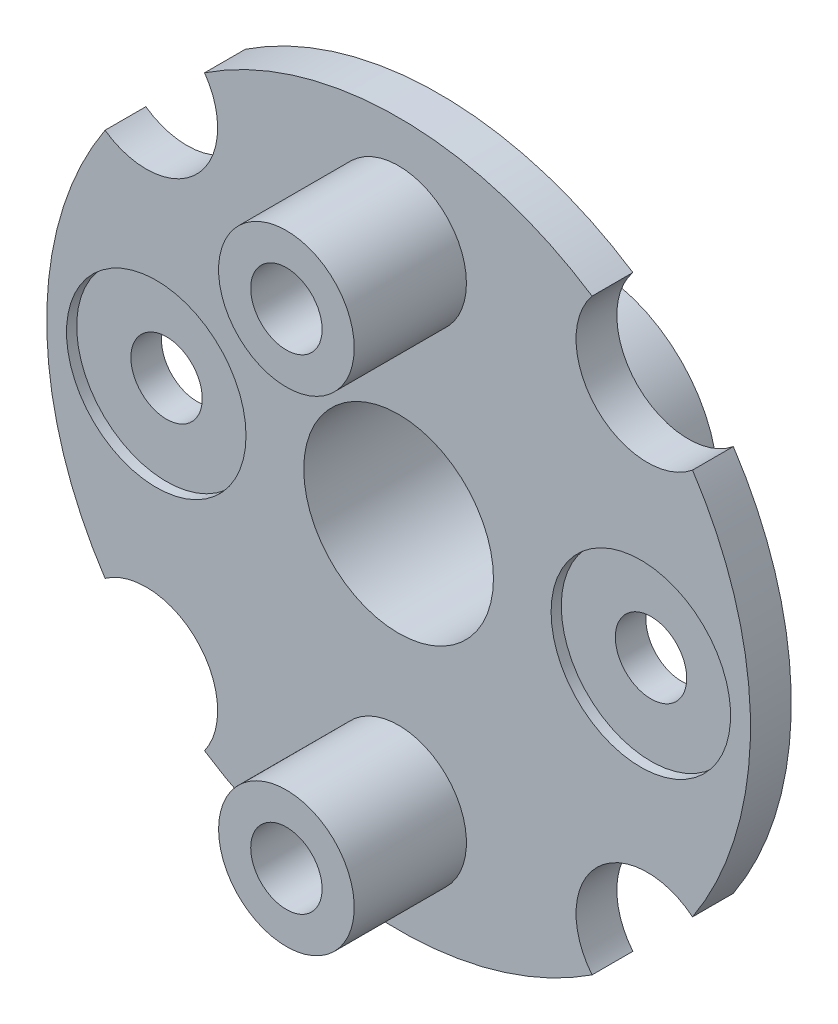
ISO-10303-21;
HEADER;
FILE_DESCRIPTION(('STEP AP214'),'2;1');
FILE_NAME('part.step','',(''),(''),'','','');
FILE_SCHEMA(('AUTOMOTIVE_DESIGN { 1 0 10303 214 1 1 1 1 }'));
ENDSEC;
DATA;
#1=APPLICATION_CONTEXT('core data for automotive mechanical design processes');
#2=APPLICATION_PROTOCOL_DEFINITION('international standard','automotive_design',2000,#1);
#3=PRODUCT_CONTEXT('',#1,'mechanical');
#4=PRODUCT('Part','Part','',(#3));
#5=PRODUCT_RELATED_PRODUCT_CATEGORY('part','',(#4));
#6=PRODUCT_DEFINITION_FORMATION('','',#4);
#7=PRODUCT_DEFINITION_CONTEXT('part definition',#1,'design');
#8=PRODUCT_DEFINITION('design','',#6,#7);
#9=PRODUCT_DEFINITION_SHAPE('','',#8);
#10=(LENGTH_UNIT() NAMED_UNIT(*) SI_UNIT(.MILLI.,.METRE.));
#11=(NAMED_UNIT(*) PLANE_ANGLE_UNIT() SI_UNIT($,.RADIAN.));
#12=(NAMED_UNIT(*) SI_UNIT($,.STERADIAN.) SOLID_ANGLE_UNIT());
#13=UNCERTAINTY_MEASURE_WITH_UNIT(LENGTH_MEASURE(1.E-05),#10,'distance_accuracy_value','');
#14=(GEOMETRIC_REPRESENTATION_CONTEXT(3) GLOBAL_UNCERTAINTY_ASSIGNED_CONTEXT((#13)) GLOBAL_UNIT_ASSIGNED_CONTEXT((#10,
#11,#12)) REPRESENTATION_CONTEXT('',''));
#15=CARTESIAN_POINT('',(0.,0.,0.));
#16=DIRECTION('',(0.,0.,1.));
#17=DIRECTION('',(1.,0.,0.));
#18=AXIS2_PLACEMENT_3D('',#15,#16,#17);
#19=CARTESIAN_POINT('',(-11.875,0.,2.));
#20=DIRECTION('',(0.,0.,-1.));
#21=DIRECTION('',(-1.,0.,0.));
#22=AXIS2_PLACEMENT_3D('',#19,#20,#21);
#23=CYLINDRICAL_SURFACE('',#22,1.75);
#24=CARTESIAN_POINT('',(-11.875,0.,0.));
#25=DIRECTION('',(0.,0.,1.));
#26=DIRECTION('',(1.,0.,0.));
#27=AXIS2_PLACEMENT_3D('',#24,#25,#26);
#28=CIRCLE('',#27,1.75);
#29=CARTESIAN_POINT('',(-10.125,0.,0.));
#30=VERTEX_POINT('',#29);
#31=EDGE_CURVE('E133',#30,#30,#28,.F.);
#32=ORIENTED_EDGE('',*,*,#31,.T.);
#33=EDGE_LOOP('',(#32));
#34=FACE_BOUND('',#33,.T.);
#35=CARTESIAN_POINT('',(-11.875,0.,1.5));
#36=DIRECTION('',(0.,0.,1.));
#37=DIRECTION('',(1.,0.,0.));
#38=AXIS2_PLACEMENT_3D('',#35,#36,#37);
#39=CIRCLE('',#38,1.75);
#40=CARTESIAN_POINT('',(-10.125,0.,1.5));
#41=VERTEX_POINT('',#40);
#42=EDGE_CURVE('E174',#41,#41,#39,.F.);
#43=ORIENTED_EDGE('',*,*,#42,.F.);
#44=EDGE_LOOP('',(#43));
#45=FACE_BOUND('',#44,.T.);
#46=ADVANCED_FACE('F34',(#34,#45),#23,.F.);
#47=CARTESIAN_POINT('',(0.,0.,2.));
#48=DIRECTION('',(0.,0.,1.));
#49=DIRECTION('',(1.,0.,0.));
#50=AXIS2_PLACEMENT_3D('',#47,#48,#49);
#51=PLANE('',#50);
#52=CARTESIAN_POINT('',(11.875,0.,2.));
#53=DIRECTION('',(0.,0.,1.));
#54=DIRECTION('',(-1.,0.,0.));
#55=AXIS2_PLACEMENT_3D('',#52,#53,#54);
#56=CIRCLE('',#55,4.4);
#57=CARTESIAN_POINT('',(7.475,0.,2.));
#58=VERTEX_POINT('',#57);
#59=EDGE_CURVE('E191',#58,#58,#56,.T.);
#60=ORIENTED_EDGE('',*,*,#59,.F.);
#61=EDGE_LOOP('',(#60));
#62=FACE_BOUND('',#61,.T.);
#63=CARTESIAN_POINT('',(-11.88,0.,2.));
#64=DIRECTION('',(0.,0.,1.));
#65=DIRECTION('',(1.,0.,0.));
#66=AXIS2_PLACEMENT_3D('',#63,#64,#65);
#67=CIRCLE('',#66,4.4);
#68=CARTESIAN_POINT('',(-7.48,0.,2.));
#69=VERTEX_POINT('',#68);
#70=EDGE_CURVE('E184',#69,#69,#67,.T.);
#71=ORIENTED_EDGE('',*,*,#70,.F.);
#72=EDGE_LOOP('',(#71));
#73=FACE_BOUND('',#72,.T.);
#74=CARTESIAN_POINT('',(0.,11.875,2.));
#75=DIRECTION('',(0.,0.,1.));
#76=DIRECTION('',(1.,0.,0.));
#77=AXIS2_PLACEMENT_3D('',#74,#75,#76);
#78=CIRCLE('',#77,3.325);
#79=CARTESIAN_POINT('',(3.325,11.875,2.));
#80=VERTEX_POINT('',#79);
#81=EDGE_CURVE('E202',#80,#80,#78,.T.);
#82=ORIENTED_EDGE('',*,*,#81,.F.);
#83=EDGE_LOOP('',(#82));
#84=FACE_BOUND('',#83,.T.);
#85=CARTESIAN_POINT('',(0.,0.,2.));
#86=DIRECTION('',(0.,0.,1.));
#87=DIRECTION('',(1.,0.,0.));
#88=AXIS2_PLACEMENT_3D('',#85,#86,#87);
#89=CIRCLE('',#88,4.65);
#90=CARTESIAN_POINT('',(4.65,0.,2.));
#91=VERTEX_POINT('',#90);
#92=EDGE_CURVE('E164',#91,#91,#89,.T.);
#93=ORIENTED_EDGE('',*,*,#92,.F.);
#94=EDGE_LOOP('',(#93));
#95=FACE_BOUND('',#94,.T.);
#96=CARTESIAN_POINT('',(12.197591975468,-12.1975919754679,2.));
#97=DIRECTION('',(0.,0.,1.));
#98=DIRECTION('',(1.,0.,0.));
#99=AXIS2_PLACEMENT_3D('',#96,#97,#98);
#100=CIRCLE('',#99,3.5);
#101=CARTESIAN_POINT('',(9.48441267789938,-14.4086229791504,2.));
#102=VERTEX_POINT('',#101);
#103=CARTESIAN_POINT('',(14.4086229791504,-9.48441267789933,2.));
#104=VERTEX_POINT('',#103);
#105=EDGE_CURVE('E215',#102,#104,#100,.F.);
#106=ORIENTED_EDGE('',*,*,#105,.T.);
#107=CARTESIAN_POINT('',(0.,0.,2.));
#108=DIRECTION('',(0.,0.,1.));
#109=DIRECTION('',(1.,0.,0.));
#110=AXIS2_PLACEMENT_3D('',#107,#108,#109);
#111=CIRCLE('',#110,17.25);
#112=CARTESIAN_POINT('',(14.4086229791505,9.48441267789933,2.));
#113=VERTEX_POINT('',#112);
#114=EDGE_CURVE('E96',#104,#113,#111,.T.);
#115=ORIENTED_EDGE('',*,*,#114,.T.);
#116=CARTESIAN_POINT('',(12.197591975468,12.1975919754679,2.));
#117=DIRECTION('',(0.,0.,1.));
#118=DIRECTION('',(1.,0.,0.));
#119=AXIS2_PLACEMENT_3D('',#116,#117,#118);
#120=CIRCLE('',#119,3.5);
#121=CARTESIAN_POINT('',(9.48441267789937,14.4086229791504,2.));
#122=VERTEX_POINT('',#121);
#123=EDGE_CURVE('E218',#122,#113,#120,.T.);
#124=ORIENTED_EDGE('',*,*,#123,.F.);
#125=CARTESIAN_POINT('',(0.,0.,2.));
#126=DIRECTION('',(0.,0.,1.));
#127=DIRECTION('',(1.,0.,0.));
#128=AXIS2_PLACEMENT_3D('',#125,#126,#127);
#129=CIRCLE('',#128,17.25);
#130=CARTESIAN_POINT('',(-9.51211084499058,14.390352576383,2.));
#131=VERTEX_POINT('',#130);
#132=EDGE_CURVE('E221',#122,#131,#129,.T.);
#133=ORIENTED_EDGE('',*,*,#132,.T.);
#134=CARTESIAN_POINT('',(-12.370384907651,12.370384907651,2.));
#135=DIRECTION('',(0.,0.,1.));
#136=DIRECTION('',(1.,0.,0.));
#137=AXIS2_PLACEMENT_3D('',#134,#135,#136);
#138=CIRCLE('',#137,3.5);
#139=CARTESIAN_POINT('',(-14.390352576383,9.51211084499056,2.));
#140=VERTEX_POINT('',#139);
#141=EDGE_CURVE('E117',#140,#131,#138,.T.);
#142=ORIENTED_EDGE('',*,*,#141,.F.);
#143=CARTESIAN_POINT('',(0.,0.,2.));
#144=DIRECTION('',(0.,0.,1.));
#145=DIRECTION('',(1.,0.,0.));
#146=AXIS2_PLACEMENT_3D('',#143,#144,#145);
#147=CIRCLE('',#146,17.25);
#148=CARTESIAN_POINT('',(-14.390352576383,-9.51211084499055,2.));
#149=VERTEX_POINT('',#148);
#150=EDGE_CURVE('E110',#140,#149,#147,.T.);
#151=ORIENTED_EDGE('',*,*,#150,.T.);
#152=CARTESIAN_POINT('',(-12.370384907651,-12.370384907651,2.));
#153=DIRECTION('',(0.,0.,1.));
#154=DIRECTION('',(1.,0.,0.));
#155=AXIS2_PLACEMENT_3D('',#152,#153,#154);
#156=CIRCLE('',#155,3.5);
#157=CARTESIAN_POINT('',(-9.51211084499056,-14.390352576383,2.));
#158=VERTEX_POINT('',#157);
#159=EDGE_CURVE('E115',#149,#158,#156,.F.);
#160=ORIENTED_EDGE('',*,*,#159,.T.);
#161=CARTESIAN_POINT('',(0.,0.,2.));
#162=DIRECTION('',(0.,0.,1.));
#163=DIRECTION('',(1.,0.,0.));
#164=AXIS2_PLACEMENT_3D('',#161,#162,#163);
#165=CIRCLE('',#164,17.25);
#166=EDGE_CURVE('E52',#158,#102,#165,.T.);
#167=ORIENTED_EDGE('',*,*,#166,.T.);
#168=EDGE_LOOP('',(#106,#115,#124,#133,#142,#151,#160,#167));
#169=FACE_BOUND('',#168,.T.);
#170=CARTESIAN_POINT('',(0.,-11.875,2.));
#171=DIRECTION('',(0.,0.,1.));
#172=DIRECTION('',(-1.,0.,0.));
#173=AXIS2_PLACEMENT_3D('',#170,#171,#172);
#174=CIRCLE('',#173,3.325);
#175=CARTESIAN_POINT('',(-3.325,-11.875,2.));
#176=VERTEX_POINT('',#175);
#177=EDGE_CURVE('E181',#176,#176,#174,.T.);
#178=ORIENTED_EDGE('',*,*,#177,.F.);
#179=EDGE_LOOP('',(#178));
#180=FACE_BOUND('',#179,.T.);
#181=ADVANCED_FACE('F112',(#62,#73,#84,#95,#169,#180),#51,.T.);
#182=CARTESIAN_POINT('',(0.,0.,0.));
#183=DIRECTION('',(0.,0.,1.));
#184=DIRECTION('',(1.,0.,0.));
#185=AXIS2_PLACEMENT_3D('',#182,#183,#184);
#186=PLANE('',#185);
#187=CARTESIAN_POINT('',(12.197591975468,-12.1975919754679,0.));
#188=DIRECTION('',(0.,0.,1.));
#189=DIRECTION('',(1.,0.,0.));
#190=AXIS2_PLACEMENT_3D('',#187,#188,#189);
#191=CIRCLE('',#190,3.5);
#192=CARTESIAN_POINT('',(9.48441267789938,-14.4086229791504,0.));
#193=VERTEX_POINT('',#192);
#194=CARTESIAN_POINT('',(14.4086229791504,-9.48441267789933,0.));
#195=VERTEX_POINT('',#194);
#196=EDGE_CURVE('E146',#193,#195,#191,.F.);
#197=ORIENTED_EDGE('',*,*,#196,.F.);
#198=CARTESIAN_POINT('',(0.,0.,0.));
#199=DIRECTION('',(0.,0.,1.));
#200=DIRECTION('',(1.,0.,0.));
#201=AXIS2_PLACEMENT_3D('',#198,#199,#200);
#202=CIRCLE('',#201,17.25);
#203=CARTESIAN_POINT('',(-9.51211084499056,-14.390352576383,0.));
#204=VERTEX_POINT('',#203);
#205=EDGE_CURVE('E87',#204,#193,#202,.T.);
#206=ORIENTED_EDGE('',*,*,#205,.F.);
#207=CARTESIAN_POINT('',(-12.370384907651,-12.370384907651,0.));
#208=DIRECTION('',(0.,0.,1.));
#209=DIRECTION('',(1.,0.,0.));
#210=AXIS2_PLACEMENT_3D('',#207,#208,#209);
#211=CIRCLE('',#210,3.5);
#212=CARTESIAN_POINT('',(-14.390352576383,-9.51211084499055,0.));
#213=VERTEX_POINT('',#212);
#214=EDGE_CURVE('E81',#213,#204,#211,.F.);
#215=ORIENTED_EDGE('',*,*,#214,.F.);
#216=CARTESIAN_POINT('',(0.,0.,0.));
#217=DIRECTION('',(0.,0.,1.));
#218=DIRECTION('',(1.,0.,0.));
#219=AXIS2_PLACEMENT_3D('',#216,#217,#218);
#220=CIRCLE('',#219,17.25);
#221=CARTESIAN_POINT('',(-14.390352576383,9.51211084499056,0.));
#222=VERTEX_POINT('',#221);
#223=EDGE_CURVE('E123',#222,#213,#220,.T.);
#224=ORIENTED_EDGE('',*,*,#223,.F.);
#225=CARTESIAN_POINT('',(-12.370384907651,12.370384907651,0.));
#226=DIRECTION('',(0.,0.,1.));
#227=DIRECTION('',(1.,0.,0.));
#228=AXIS2_PLACEMENT_3D('',#225,#226,#227);
#229=CIRCLE('',#228,3.5);
#230=CARTESIAN_POINT('',(-9.51211084499058,14.390352576383,0.));
#231=VERTEX_POINT('',#230);
#232=EDGE_CURVE('E158',#222,#231,#229,.T.);
#233=ORIENTED_EDGE('',*,*,#232,.T.);
#234=CARTESIAN_POINT('',(0.,0.,0.));
#235=DIRECTION('',(0.,0.,1.));
#236=DIRECTION('',(1.,0.,0.));
#237=AXIS2_PLACEMENT_3D('',#234,#235,#236);
#238=CIRCLE('',#237,17.25);
#239=CARTESIAN_POINT('',(9.48441267789937,14.4086229791504,0.));
#240=VERTEX_POINT('',#239);
#241=EDGE_CURVE('E155',#240,#231,#238,.T.);
#242=ORIENTED_EDGE('',*,*,#241,.F.);
#243=CARTESIAN_POINT('',(12.197591975468,12.1975919754679,0.));
#244=DIRECTION('',(0.,0.,1.));
#245=DIRECTION('',(1.,0.,0.));
#246=AXIS2_PLACEMENT_3D('',#243,#244,#245);
#247=CIRCLE('',#246,3.5);
#248=CARTESIAN_POINT('',(14.4086229791505,9.48441267789933,0.));
#249=VERTEX_POINT('',#248);
#250=EDGE_CURVE('E152',#240,#249,#247,.T.);
#251=ORIENTED_EDGE('',*,*,#250,.T.);
#252=CARTESIAN_POINT('',(0.,0.,0.));
#253=DIRECTION('',(0.,0.,1.));
#254=DIRECTION('',(1.,0.,0.));
#255=AXIS2_PLACEMENT_3D('',#252,#253,#254);
#256=CIRCLE('',#255,17.25);
#257=EDGE_CURVE('E149',#195,#249,#256,.T.);
#258=ORIENTED_EDGE('',*,*,#257,.F.);
#259=EDGE_LOOP('',(#197,#206,#215,#224,#233,#242,#251,#258));
#260=FACE_BOUND('',#259,.T.);
#261=CARTESIAN_POINT('',(0.,-11.875,0.));
#262=DIRECTION('',(0.,0.,1.));
#263=DIRECTION('',(1.,0.,0.));
#264=AXIS2_PLACEMENT_3D('',#261,#262,#263);
#265=CIRCLE('',#264,1.75);
#266=CARTESIAN_POINT('',(1.75,-11.875,0.));
#267=VERTEX_POINT('',#266);
#268=EDGE_CURVE('E143',#267,#267,#265,.F.);
#269=ORIENTED_EDGE('',*,*,#268,.F.);
#270=EDGE_LOOP('',(#269));
#271=FACE_BOUND('',#270,.T.);
#272=CARTESIAN_POINT('',(11.875,0.,0.));
#273=DIRECTION('',(0.,0.,1.));
#274=DIRECTION('',(1.,0.,0.));
#275=AXIS2_PLACEMENT_3D('',#272,#273,#274);
#276=CIRCLE('',#275,1.75);
#277=CARTESIAN_POINT('',(13.625,0.,0.));
#278=VERTEX_POINT('',#277);
#279=EDGE_CURVE('E140',#278,#278,#276,.T.);
#280=ORIENTED_EDGE('',*,*,#279,.T.);
#281=EDGE_LOOP('',(#280));
#282=FACE_BOUND('',#281,.T.);
#283=CARTESIAN_POINT('',(0.,11.875,0.));
#284=DIRECTION('',(0.,0.,1.));
#285=DIRECTION('',(1.,0.,0.));
#286=AXIS2_PLACEMENT_3D('',#283,#284,#285);
#287=CIRCLE('',#286,1.75);
#288=CARTESIAN_POINT('',(1.75,11.875,0.));
#289=VERTEX_POINT('',#288);
#290=EDGE_CURVE('E136',#289,#289,#287,.T.);
#291=ORIENTED_EDGE('',*,*,#290,.T.);
#292=EDGE_LOOP('',(#291));
#293=FACE_BOUND('',#292,.T.);
#294=ORIENTED_EDGE('',*,*,#31,.F.);
#295=EDGE_LOOP('',(#294));
#296=FACE_BOUND('',#295,.T.);
#297=CARTESIAN_POINT('',(0.,0.,0.));
#298=DIRECTION('',(0.,0.,1.));
#299=DIRECTION('',(1.,0.,0.));
#300=AXIS2_PLACEMENT_3D('',#297,#298,#299);
#301=CIRCLE('',#300,6.15);
#302=CARTESIAN_POINT('',(6.15,0.,0.));
#303=VERTEX_POINT('',#302);
#304=EDGE_CURVE('E11',#303,#303,#301,.F.);
#305=ORIENTED_EDGE('',*,*,#304,.F.);
#306=EDGE_LOOP('',(#305));
#307=FACE_BOUND('',#306,.T.);
#308=ADVANCED_FACE('F228',(#260,#271,#282,#293,#296,#307),#186,.F.);
#309=CARTESIAN_POINT('',(12.197591975468,-12.1975919754679,2.));
#310=DIRECTION('',(0.,0.,-1.));
#311=DIRECTION('',(-1.,0.,0.));
#312=AXIS2_PLACEMENT_3D('',#309,#310,#311);
#313=CYLINDRICAL_SURFACE('',#312,3.5);
#314=ORIENTED_EDGE('',*,*,#196,.T.);
#315=DIRECTION('',(0.,0.,-1.));
#316=VECTOR('',#315,1.);
#317=CARTESIAN_POINT('',(14.4086229791504,-9.48441267789933,2.));
#318=LINE('',#317,#316);
#319=EDGE_CURVE('E43',#104,#195,#318,.T.);
#320=ORIENTED_EDGE('',*,*,#319,.F.);
#321=ORIENTED_EDGE('',*,*,#105,.F.);
#322=DIRECTION('',(0.,0.,-1.));
#323=VECTOR('',#322,1.);
#324=CARTESIAN_POINT('',(9.48441267789938,-14.4086229791504,2.));
#325=LINE('',#324,#323);
#326=EDGE_CURVE('E129',#102,#193,#325,.T.);
#327=ORIENTED_EDGE('',*,*,#326,.T.);
#328=EDGE_LOOP('',(#314,#320,#321,#327));
#329=FACE_BOUND('',#328,.T.);
#330=ADVANCED_FACE('F233',(#329),#313,.F.);
#331=CARTESIAN_POINT('',(0.,0.,2.));
#332=DIRECTION('',(0.,0.,-1.));
#333=DIRECTION('',(-1.,0.,0.));
#334=AXIS2_PLACEMENT_3D('',#331,#332,#333);
#335=CYLINDRICAL_SURFACE('',#334,17.25);
#336=ORIENTED_EDGE('',*,*,#257,.T.);
#337=DIRECTION('',(0.,0.,-1.));
#338=VECTOR('',#337,1.);
#339=CARTESIAN_POINT('',(14.4086229791505,9.48441267789933,2.));
#340=LINE('',#339,#338);
#341=EDGE_CURVE('E172',#113,#249,#340,.T.);
#342=ORIENTED_EDGE('',*,*,#341,.F.);
#343=ORIENTED_EDGE('',*,*,#114,.F.);
#344=ORIENTED_EDGE('',*,*,#319,.T.);
#345=EDGE_LOOP('',(#336,#342,#343,#344));
#346=FACE_BOUND('',#345,.T.);
#347=ADVANCED_FACE('F348',(#346),#335,.T.);
#348=CARTESIAN_POINT('',(12.197591975468,12.1975919754679,2.));
#349=DIRECTION('',(0.,0.,-1.));
#350=DIRECTION('',(-1.,0.,0.));
#351=AXIS2_PLACEMENT_3D('',#348,#349,#350);
#352=CYLINDRICAL_SURFACE('',#351,3.5);
#353=ORIENTED_EDGE('',*,*,#250,.F.);
#354=DIRECTION('',(0.,0.,-1.));
#355=VECTOR('',#354,1.);
#356=CARTESIAN_POINT('',(9.48441267789937,14.4086229791504,2.));
#357=LINE('',#356,#355);
#358=EDGE_CURVE('E170',#122,#240,#357,.T.);
#359=ORIENTED_EDGE('',*,*,#358,.F.);
#360=ORIENTED_EDGE('',*,*,#123,.T.);
#361=ORIENTED_EDGE('',*,*,#341,.T.);
#362=EDGE_LOOP('',(#353,#359,#360,#361));
#363=FACE_BOUND('',#362,.T.);
#364=ADVANCED_FACE('F351',(#363),#352,.F.);
#365=CARTESIAN_POINT('',(0.,0.,2.));
#366=DIRECTION('',(0.,0.,-1.));
#367=DIRECTION('',(-1.,0.,0.));
#368=AXIS2_PLACEMENT_3D('',#365,#366,#367);
#369=CYLINDRICAL_SURFACE('',#368,17.25);
#370=ORIENTED_EDGE('',*,*,#241,.T.);
#371=DIRECTION('',(0.,0.,-1.));
#372=VECTOR('',#371,1.);
#373=CARTESIAN_POINT('',(-9.51211084499058,14.390352576383,2.));
#374=LINE('',#373,#372);
#375=EDGE_CURVE('E168',#131,#231,#374,.T.);
#376=ORIENTED_EDGE('',*,*,#375,.F.);
#377=ORIENTED_EDGE('',*,*,#132,.F.);
#378=ORIENTED_EDGE('',*,*,#358,.T.);
#379=EDGE_LOOP('',(#370,#376,#377,#378));
#380=FACE_BOUND('',#379,.T.);
#381=ADVANCED_FACE('F354',(#380),#369,.T.);
#382=CARTESIAN_POINT('',(-12.370384907651,12.370384907651,2.));
#383=DIRECTION('',(0.,0.,-1.));
#384=DIRECTION('',(-1.,0.,0.));
#385=AXIS2_PLACEMENT_3D('',#382,#383,#384);
#386=CYLINDRICAL_SURFACE('',#385,3.5);
#387=ORIENTED_EDGE('',*,*,#232,.F.);
#388=DIRECTION('',(0.,0.,-1.));
#389=VECTOR('',#388,1.);
#390=CARTESIAN_POINT('',(-14.390352576383,9.51211084499056,2.));
#391=LINE('',#390,#389);
#392=EDGE_CURVE('E124',#140,#222,#391,.T.);
#393=ORIENTED_EDGE('',*,*,#392,.F.);
#394=ORIENTED_EDGE('',*,*,#141,.T.);
#395=ORIENTED_EDGE('',*,*,#375,.T.);
#396=EDGE_LOOP('',(#387,#393,#394,#395));
#397=FACE_BOUND('',#396,.T.);
#398=ADVANCED_FACE('F224',(#397),#386,.F.);
#399=CARTESIAN_POINT('',(0.,0.,2.));
#400=DIRECTION('',(0.,0.,-1.));
#401=DIRECTION('',(-1.,0.,0.));
#402=AXIS2_PLACEMENT_3D('',#399,#400,#401);
#403=CYLINDRICAL_SURFACE('',#402,17.25);
#404=ORIENTED_EDGE('',*,*,#223,.T.);
#405=DIRECTION('',(0.,0.,-1.));
#406=VECTOR('',#405,1.);
#407=CARTESIAN_POINT('',(-14.390352576383,-9.51211084499055,2.));
#408=LINE('',#407,#406);
#409=EDGE_CURVE('E120',#149,#213,#408,.T.);
#410=ORIENTED_EDGE('',*,*,#409,.F.);
#411=ORIENTED_EDGE('',*,*,#150,.F.);
#412=ORIENTED_EDGE('',*,*,#392,.T.);
#413=EDGE_LOOP('',(#404,#410,#411,#412));
#414=FACE_BOUND('',#413,.T.);
#415=ADVANCED_FACE('F121',(#414),#403,.T.);
#416=CARTESIAN_POINT('',(-12.370384907651,-12.370384907651,2.));
#417=DIRECTION('',(0.,0.,-1.));
#418=DIRECTION('',(-1.,0.,0.));
#419=AXIS2_PLACEMENT_3D('',#416,#417,#418);
#420=CYLINDRICAL_SURFACE('',#419,3.5);
#421=ORIENTED_EDGE('',*,*,#214,.T.);
#422=DIRECTION('',(0.,0.,-1.));
#423=VECTOR('',#422,1.);
#424=CARTESIAN_POINT('',(-9.51211084499056,-14.390352576383,2.));
#425=LINE('',#424,#423);
#426=EDGE_CURVE('E125',#158,#204,#425,.T.);
#427=ORIENTED_EDGE('',*,*,#426,.F.);
#428=ORIENTED_EDGE('',*,*,#159,.F.);
#429=ORIENTED_EDGE('',*,*,#409,.T.);
#430=EDGE_LOOP('',(#421,#427,#428,#429));
#431=FACE_BOUND('',#430,.T.);
#432=ADVANCED_FACE('F127',(#431),#420,.F.);
#433=CARTESIAN_POINT('',(0.,-11.875,2.));
#434=DIRECTION('',(0.,0.,-1.));
#435=DIRECTION('',(-1.,0.,0.));
#436=AXIS2_PLACEMENT_3D('',#433,#434,#435);
#437=CYLINDRICAL_SURFACE('',#436,1.75);
#438=ORIENTED_EDGE('',*,*,#268,.T.);
#439=EDGE_LOOP('',(#438));
#440=FACE_BOUND('',#439,.T.);
#441=CARTESIAN_POINT('',(0.,-11.875,7.5));
#442=DIRECTION('',(0.,0.,1.));
#443=DIRECTION('',(-1.,0.,0.));
#444=AXIS2_PLACEMENT_3D('',#441,#442,#443);
#445=CIRCLE('',#444,1.75);
#446=CARTESIAN_POINT('',(-1.75,-11.875,7.5));
#447=VERTEX_POINT('',#446);
#448=EDGE_CURVE('E176',#447,#447,#445,.T.);
#449=ORIENTED_EDGE('',*,*,#448,.T.);
#450=EDGE_LOOP('',(#449));
#451=FACE_BOUND('',#450,.T.);
#452=ADVANCED_FACE('F328',(#440,#451),#437,.F.);
#453=CARTESIAN_POINT('',(11.875,0.,2.));
#454=DIRECTION('',(0.,0.,-1.));
#455=DIRECTION('',(-1.,0.,0.));
#456=AXIS2_PLACEMENT_3D('',#453,#454,#455);
#457=CYLINDRICAL_SURFACE('',#456,1.75);
#458=CARTESIAN_POINT('',(11.875,0.,1.5));
#459=DIRECTION('',(0.,0.,-1.));
#460=DIRECTION('',(-1.,0.,0.));
#461=AXIS2_PLACEMENT_3D('',#458,#459,#460);
#462=CIRCLE('',#461,1.75);
#463=CARTESIAN_POINT('',(10.125,0.,1.5));
#464=VERTEX_POINT('',#463);
#465=EDGE_CURVE('E37',#464,#464,#462,.T.);
#466=ORIENTED_EDGE('',*,*,#465,.F.);
#467=EDGE_LOOP('',(#466));
#468=FACE_BOUND('',#467,.T.);
#469=ORIENTED_EDGE('',*,*,#279,.F.);
#470=EDGE_LOOP('',(#469));
#471=FACE_BOUND('',#470,.T.);
#472=ADVANCED_FACE('F325',(#468,#471),#457,.F.);
#473=CARTESIAN_POINT('',(0.,11.875,2.));
#474=DIRECTION('',(0.,0.,-1.));
#475=DIRECTION('',(-1.,0.,0.));
#476=AXIS2_PLACEMENT_3D('',#473,#474,#475);
#477=CYLINDRICAL_SURFACE('',#476,1.75);
#478=ORIENTED_EDGE('',*,*,#290,.F.);
#479=EDGE_LOOP('',(#478));
#480=FACE_BOUND('',#479,.T.);
#481=CARTESIAN_POINT('',(0.,11.875,7.5));
#482=DIRECTION('',(0.,0.,1.));
#483=DIRECTION('',(1.,0.,0.));
#484=AXIS2_PLACEMENT_3D('',#481,#482,#483);
#485=CIRCLE('',#484,1.75);
#486=CARTESIAN_POINT('',(1.75,11.875,7.5));
#487=VERTEX_POINT('',#486);
#488=EDGE_CURVE('E197',#487,#487,#485,.T.);
#489=ORIENTED_EDGE('',*,*,#488,.T.);
#490=EDGE_LOOP('',(#489));
#491=FACE_BOUND('',#490,.T.);
#492=ADVANCED_FACE('F247',(#480,#491),#477,.F.);
#493=CARTESIAN_POINT('',(0.,0.,2.));
#494=DIRECTION('',(0.,0.,-1.));
#495=DIRECTION('',(-1.,0.,0.));
#496=AXIS2_PLACEMENT_3D('',#493,#494,#495);
#497=CYLINDRICAL_SURFACE('',#496,4.65);
#498=ORIENTED_EDGE('',*,*,#92,.T.);
#499=EDGE_LOOP('',(#498));
#500=FACE_BOUND('',#499,.T.);
#501=CARTESIAN_POINT('',(0.,0.,-7.5));
#502=DIRECTION('',(0.,0.,-1.));
#503=DIRECTION('',(-1.,0.,0.));
#504=AXIS2_PLACEMENT_3D('',#501,#502,#503);
#505=CIRCLE('',#504,4.65);
#506=CARTESIAN_POINT('',(-4.65,0.,-7.5));
#507=VERTEX_POINT('',#506);
#508=EDGE_CURVE('E206',#507,#507,#505,.T.);
#509=ORIENTED_EDGE('',*,*,#508,.T.);
#510=EDGE_LOOP('',(#509));
#511=FACE_BOUND('',#510,.T.);
#512=ADVANCED_FACE('F238',(#500,#511),#497,.F.);
#513=CARTESIAN_POINT('',(0.,0.,2.));
#514=DIRECTION('',(0.,0.,-1.));
#515=DIRECTION('',(-1.,0.,0.));
#516=AXIS2_PLACEMENT_3D('',#513,#514,#515);
#517=CYLINDRICAL_SURFACE('',#516,17.25);
#518=ORIENTED_EDGE('',*,*,#205,.T.);
#519=ORIENTED_EDGE('',*,*,#326,.F.);
#520=ORIENTED_EDGE('',*,*,#166,.F.);
#521=ORIENTED_EDGE('',*,*,#426,.T.);
#522=EDGE_LOOP('',(#518,#519,#520,#521));
#523=FACE_BOUND('',#522,.T.);
#524=ADVANCED_FACE('F235',(#523),#517,.T.);
#525=CARTESIAN_POINT('',(0.,0.,-7.5));
#526=DIRECTION('',(0.,0.,-1.));
#527=DIRECTION('',(-1.,0.,0.));
#528=AXIS2_PLACEMENT_3D('',#525,#526,#527);
#529=PLANE('',#528);
#530=CARTESIAN_POINT('',(0.,0.,-7.5));
#531=DIRECTION('',(0.,0.,-1.));
#532=DIRECTION('',(-1.,0.,0.));
#533=AXIS2_PLACEMENT_3D('',#530,#531,#532);
#534=CIRCLE('',#533,6.15);
#535=CARTESIAN_POINT('',(-6.15,0.,-7.5));
#536=VERTEX_POINT('',#535);
#537=EDGE_CURVE('E137',#536,#536,#534,.T.);
#538=ORIENTED_EDGE('',*,*,#537,.T.);
#539=EDGE_LOOP('',(#538));
#540=FACE_BOUND('',#539,.T.);
#541=ORIENTED_EDGE('',*,*,#508,.F.);
#542=EDGE_LOOP('',(#541));
#543=FACE_BOUND('',#542,.T.);
#544=ADVANCED_FACE('F237',(#540,#543),#529,.T.);
#545=CARTESIAN_POINT('',(0.,0.,-7.5));
#546=DIRECTION('',(0.,0.,1.));
#547=DIRECTION('',(1.,0.,0.));
#548=AXIS2_PLACEMENT_3D('',#545,#546,#547);
#549=CYLINDRICAL_SURFACE('',#548,6.15);
#550=ORIENTED_EDGE('',*,*,#537,.F.);
#551=EDGE_LOOP('',(#550));
#552=FACE_BOUND('',#551,.T.);
#553=ORIENTED_EDGE('',*,*,#304,.T.);
#554=EDGE_LOOP('',(#553));
#555=FACE_BOUND('',#554,.T.);
#556=ADVANCED_FACE('F244',(#552,#555),#549,.T.);
#557=CARTESIAN_POINT('',(0.,11.875,7.5));
#558=DIRECTION('',(0.,0.,1.));
#559=DIRECTION('',(1.,0.,0.));
#560=AXIS2_PLACEMENT_3D('',#557,#558,#559);
#561=PLANE('',#560);
#562=CARTESIAN_POINT('',(0.,11.875,7.5));
#563=DIRECTION('',(0.,0.,1.));
#564=DIRECTION('',(1.,0.,0.));
#565=AXIS2_PLACEMENT_3D('',#562,#563,#564);
#566=CIRCLE('',#565,3.325);
#567=CARTESIAN_POINT('',(3.325,11.875,7.5));
#568=VERTEX_POINT('',#567);
#569=EDGE_CURVE('E203',#568,#568,#566,.T.);
#570=ORIENTED_EDGE('',*,*,#569,.T.);
#571=EDGE_LOOP('',(#570));
#572=FACE_BOUND('',#571,.T.);
#573=ORIENTED_EDGE('',*,*,#488,.F.);
#574=EDGE_LOOP('',(#573));
#575=FACE_BOUND('',#574,.T.);
#576=ADVANCED_FACE('F266',(#572,#575),#561,.T.);
#577=CARTESIAN_POINT('',(0.,11.875,7.5));
#578=DIRECTION('',(0.,0.,-1.));
#579=DIRECTION('',(-1.,0.,0.));
#580=AXIS2_PLACEMENT_3D('',#577,#578,#579);
#581=CYLINDRICAL_SURFACE('',#580,3.325);
#582=ORIENTED_EDGE('',*,*,#569,.F.);
#583=EDGE_LOOP('',(#582));
#584=FACE_BOUND('',#583,.T.);
#585=ORIENTED_EDGE('',*,*,#81,.T.);
#586=EDGE_LOOP('',(#585));
#587=FACE_BOUND('',#586,.T.);
#588=ADVANCED_FACE('F272',(#584,#587),#581,.T.);
#589=CARTESIAN_POINT('',(0.,-11.875,7.5));
#590=DIRECTION('',(0.,0.,-1.));
#591=DIRECTION('',(-1.,0.,0.));
#592=AXIS2_PLACEMENT_3D('',#589,#590,#591);
#593=PLANE('',#592);
#594=CARTESIAN_POINT('',(0.,-11.875,7.5));
#595=DIRECTION('',(0.,0.,1.));
#596=DIRECTION('',(-1.,0.,0.));
#597=AXIS2_PLACEMENT_3D('',#594,#595,#596);
#598=CIRCLE('',#597,3.325);
#599=CARTESIAN_POINT('',(-3.325,-11.875,7.5));
#600=VERTEX_POINT('',#599);
#601=EDGE_CURVE('E194',#600,#600,#598,.T.);
#602=ORIENTED_EDGE('',*,*,#601,.T.);
#603=EDGE_LOOP('',(#602));
#604=FACE_BOUND('',#603,.T.);
#605=ORIENTED_EDGE('',*,*,#448,.F.);
#606=EDGE_LOOP('',(#605));
#607=FACE_BOUND('',#606,.T.);
#608=ADVANCED_FACE('F278',(#604,#607),#593,.F.);
#609=CARTESIAN_POINT('',(0.,-11.875,7.5));
#610=DIRECTION('',(0.,0.,-1.));
#611=DIRECTION('',(-1.,0.,0.));
#612=AXIS2_PLACEMENT_3D('',#609,#610,#611);
#613=CYLINDRICAL_SURFACE('',#612,3.325);
#614=ORIENTED_EDGE('',*,*,#601,.F.);
#615=EDGE_LOOP('',(#614));
#616=FACE_BOUND('',#615,.T.);
#617=ORIENTED_EDGE('',*,*,#177,.T.);
#618=EDGE_LOOP('',(#617));
#619=FACE_BOUND('',#618,.T.);
#620=ADVANCED_FACE('F281',(#616,#619),#613,.T.);
#621=CARTESIAN_POINT('',(-11.88,0.,1.5));
#622=DIRECTION('',(0.,0.,1.));
#623=DIRECTION('',(1.,0.,0.));
#624=AXIS2_PLACEMENT_3D('',#621,#622,#623);
#625=PLANE('',#624);
#626=CARTESIAN_POINT('',(-11.88,0.,1.5));
#627=DIRECTION('',(0.,0.,1.));
#628=DIRECTION('',(1.,0.,0.));
#629=AXIS2_PLACEMENT_3D('',#626,#627,#628);
#630=CIRCLE('',#629,4.4);
#631=CARTESIAN_POINT('',(-7.48,0.,1.5));
#632=VERTEX_POINT('',#631);
#633=EDGE_CURVE('E177',#632,#632,#630,.T.);
#634=ORIENTED_EDGE('',*,*,#633,.T.);
#635=EDGE_LOOP('',(#634));
#636=FACE_BOUND('',#635,.T.);
#637=ORIENTED_EDGE('',*,*,#42,.T.);
#638=EDGE_LOOP('',(#637));
#639=FACE_BOUND('',#638,.T.);
#640=ADVANCED_FACE('F284',(#636,#639),#625,.T.);
#641=CARTESIAN_POINT('',(-11.88,0.,1.5));
#642=DIRECTION('',(0.,0.,1.));
#643=DIRECTION('',(1.,0.,0.));
#644=AXIS2_PLACEMENT_3D('',#641,#642,#643);
#645=CYLINDRICAL_SURFACE('',#644,4.4);
#646=ORIENTED_EDGE('',*,*,#633,.F.);
#647=EDGE_LOOP('',(#646));
#648=FACE_BOUND('',#647,.T.);
#649=ORIENTED_EDGE('',*,*,#70,.T.);
#650=EDGE_LOOP('',(#649));
#651=FACE_BOUND('',#650,.T.);
#652=ADVANCED_FACE('F289',(#648,#651),#645,.F.);
#653=CARTESIAN_POINT('',(11.875,0.,1.5));
#654=DIRECTION('',(0.,0.,1.));
#655=DIRECTION('',(1.,0.,0.));
#656=AXIS2_PLACEMENT_3D('',#653,#654,#655);
#657=CYLINDRICAL_SURFACE('',#656,4.4);
#658=CARTESIAN_POINT('',(11.875,0.,1.5));
#659=DIRECTION('',(0.,0.,1.));
#660=DIRECTION('',(-1.,0.,0.));
#661=AXIS2_PLACEMENT_3D('',#658,#659,#660);
#662=CIRCLE('',#661,4.4);
#663=CARTESIAN_POINT('',(7.475,0.,1.5));
#664=VERTEX_POINT('',#663);
#665=EDGE_CURVE('E309',#664,#664,#662,.T.);
#666=ORIENTED_EDGE('',*,*,#665,.F.);
#667=EDGE_LOOP('',(#666));
#668=FACE_BOUND('',#667,.T.);
#669=ORIENTED_EDGE('',*,*,#59,.T.);
#670=EDGE_LOOP('',(#669));
#671=FACE_BOUND('',#670,.T.);
#672=ADVANCED_FACE('F292',(#668,#671),#657,.F.);
#673=CARTESIAN_POINT('',(11.875,0.,1.5));
#674=DIRECTION('',(0.,0.,-1.));
#675=DIRECTION('',(-1.,0.,0.));
#676=AXIS2_PLACEMENT_3D('',#673,#674,#675);
#677=PLANE('',#676);
#678=ORIENTED_EDGE('',*,*,#465,.T.);
#679=EDGE_LOOP('',(#678));
#680=FACE_BOUND('',#679,.T.);
#681=ORIENTED_EDGE('',*,*,#665,.T.);
#682=EDGE_LOOP('',(#681));
#683=FACE_BOUND('',#682,.T.);
#684=ADVANCED_FACE('F298',(#680,#683),#677,.F.);
#685=CLOSED_SHELL('',(#46,#181,#308,#330,#347,#364,#381,#398,#415,#432,#452,#472,#492,#512,#524,
#544,#556,#576,#588,#608,#620,#640,#652,#672,#684));
#686=MANIFOLD_SOLID_BREP('B2',#685);
#687=ADVANCED_BREP_SHAPE_REPRESENTATION('',(#18,#686),#14);
#688=SHAPE_DEFINITION_REPRESENTATION(#9,#687);
ENDSEC;
END-ISO-10303-21;
